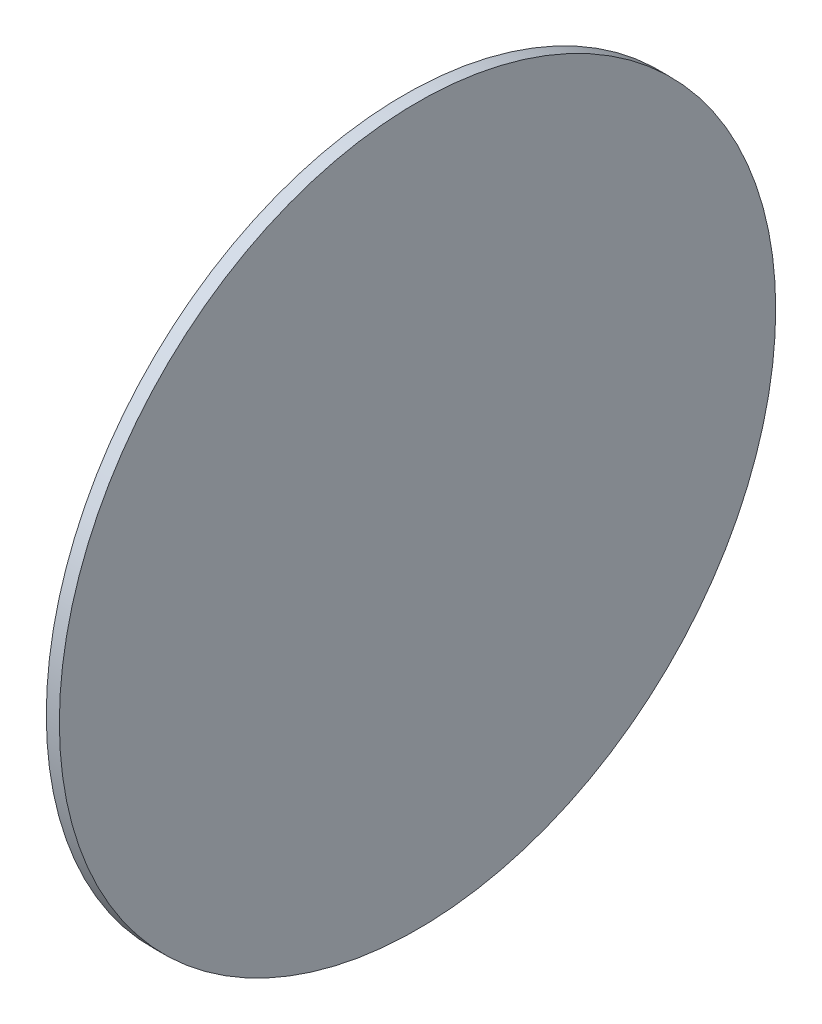
ISO-10303-21;
HEADER;
FILE_DESCRIPTION(('STEP AP214'),'2;1');
FILE_NAME('part.step','',(''),(''),'','','');
FILE_SCHEMA(('AUTOMOTIVE_DESIGN { 1 0 10303 214 1 1 1 1 }'));
ENDSEC;
DATA;
#1=APPLICATION_CONTEXT('core data for automotive mechanical design processes');
#2=APPLICATION_PROTOCOL_DEFINITION('international standard','automotive_design',2000,#1);
#3=PRODUCT_CONTEXT('',#1,'mechanical');
#4=PRODUCT('Part','Part','',(#3));
#5=PRODUCT_RELATED_PRODUCT_CATEGORY('part','',(#4));
#6=PRODUCT_DEFINITION_FORMATION('','',#4);
#7=PRODUCT_DEFINITION_CONTEXT('part definition',#1,'design');
#8=PRODUCT_DEFINITION('design','',#6,#7);
#9=PRODUCT_DEFINITION_SHAPE('','',#8);
#10=(LENGTH_UNIT() NAMED_UNIT(*) SI_UNIT(.MILLI.,.METRE.));
#11=(NAMED_UNIT(*) PLANE_ANGLE_UNIT() SI_UNIT($,.RADIAN.));
#12=(NAMED_UNIT(*) SI_UNIT($,.STERADIAN.) SOLID_ANGLE_UNIT());
#13=UNCERTAINTY_MEASURE_WITH_UNIT(LENGTH_MEASURE(1.E-05),#10,'distance_accuracy_value','');
#14=(GEOMETRIC_REPRESENTATION_CONTEXT(3) GLOBAL_UNCERTAINTY_ASSIGNED_CONTEXT((#13)) GLOBAL_UNIT_ASSIGNED_CONTEXT((#10,
#11,#12)) REPRESENTATION_CONTEXT('',''));
#15=CARTESIAN_POINT('',(0.,0.,0.));
#16=DIRECTION('',(0.,0.,1.));
#17=DIRECTION('',(1.,0.,0.));
#18=AXIS2_PLACEMENT_3D('',#15,#16,#17);
#19=CARTESIAN_POINT('',(4.75,0.,0.));
#20=DIRECTION('',(-1.,0.,0.));
#21=DIRECTION('',(0.,0.,1.));
#22=AXIS2_PLACEMENT_3D('',#19,#20,#21);
#23=CYLINDRICAL_SURFACE('',#22,130.175);
#24=CARTESIAN_POINT('',(4.75,0.,0.));
#25=DIRECTION('',(1.,0.,0.));
#26=DIRECTION('',(0.,0.,-1.));
#27=AXIS2_PLACEMENT_3D('',#24,#25,#26);
#28=CIRCLE('',#27,130.175);
#29=CARTESIAN_POINT('',(4.75,0.,-130.175));
#30=VERTEX_POINT('',#29);
#31=EDGE_CURVE('E10',#30,#30,#28,.T.);
#32=ORIENTED_EDGE('',*,*,#31,.F.);
#33=EDGE_LOOP('',(#32));
#34=FACE_BOUND('',#33,.T.);
#35=CARTESIAN_POINT('',(0.,0.,0.));
#36=DIRECTION('',(1.,0.,0.));
#37=DIRECTION('',(0.,0.,-1.));
#38=AXIS2_PLACEMENT_3D('',#35,#36,#37);
#39=CIRCLE('',#38,130.175);
#40=CARTESIAN_POINT('',(0.,0.,-130.175));
#41=VERTEX_POINT('',#40);
#42=EDGE_CURVE('E40',#41,#41,#39,.T.);
#43=ORIENTED_EDGE('',*,*,#42,.T.);
#44=EDGE_LOOP('',(#43));
#45=FACE_BOUND('',#44,.T.);
#46=ADVANCED_FACE('F37',(#34,#45),#23,.T.);
#47=CARTESIAN_POINT('',(4.75,0.,0.));
#48=DIRECTION('',(1.,0.,0.));
#49=DIRECTION('',(0.,0.,-1.));
#50=AXIS2_PLACEMENT_3D('',#47,#48,#49);
#51=PLANE('',#50);
#52=ORIENTED_EDGE('',*,*,#31,.T.);
#53=EDGE_LOOP('',(#52));
#54=FACE_BOUND('',#53,.T.);
#55=ADVANCED_FACE('F52',(#54),#51,.T.);
#56=CARTESIAN_POINT('',(0.,0.,0.));
#57=DIRECTION('',(1.,0.,0.));
#58=DIRECTION('',(0.,0.,-1.));
#59=AXIS2_PLACEMENT_3D('',#56,#57,#58);
#60=PLANE('',#59);
#61=ORIENTED_EDGE('',*,*,#42,.F.);
#62=EDGE_LOOP('',(#61));
#63=FACE_BOUND('',#62,.T.);
#64=ADVANCED_FACE('F50',(#63),#60,.F.);
#65=CLOSED_SHELL('',(#46,#55,#64));
#66=MANIFOLD_SOLID_BREP('B2',#65);
#67=ADVANCED_BREP_SHAPE_REPRESENTATION('',(#18,#66),#14);
#68=SHAPE_DEFINITION_REPRESENTATION(#9,#67);
ENDSEC;
END-ISO-10303-21;
